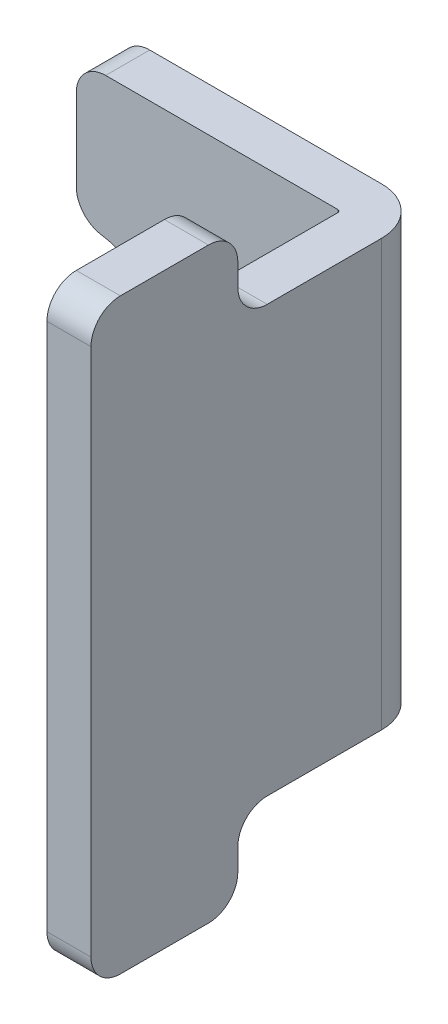
ISO-10303-21;
HEADER;
FILE_DESCRIPTION(('STEP AP214'),'2;1');
FILE_NAME('part.step','',(''),(''),'','','');
FILE_SCHEMA(('AUTOMOTIVE_DESIGN { 1 0 10303 214 1 1 1 1 }'));
ENDSEC;
DATA;
#1=APPLICATION_CONTEXT('core data for automotive mechanical design processes');
#2=APPLICATION_PROTOCOL_DEFINITION('international standard','automotive_design',2000,#1);
#3=PRODUCT_CONTEXT('',#1,'mechanical');
#4=PRODUCT('Part','Part','',(#3));
#5=PRODUCT_RELATED_PRODUCT_CATEGORY('part','',(#4));
#6=PRODUCT_DEFINITION_FORMATION('','',#4);
#7=PRODUCT_DEFINITION_CONTEXT('part definition',#1,'design');
#8=PRODUCT_DEFINITION('design','',#6,#7);
#9=PRODUCT_DEFINITION_SHAPE('','',#8);
#10=(LENGTH_UNIT() NAMED_UNIT(*) SI_UNIT(.MILLI.,.METRE.));
#11=(NAMED_UNIT(*) PLANE_ANGLE_UNIT() SI_UNIT($,.RADIAN.));
#12=(NAMED_UNIT(*) SI_UNIT($,.STERADIAN.) SOLID_ANGLE_UNIT());
#13=UNCERTAINTY_MEASURE_WITH_UNIT(LENGTH_MEASURE(1.E-05),#10,'distance_accuracy_value','');
#14=(GEOMETRIC_REPRESENTATION_CONTEXT(3) GLOBAL_UNCERTAINTY_ASSIGNED_CONTEXT((#13)) GLOBAL_UNIT_ASSIGNED_CONTEXT((#10,
#11,#12)) REPRESENTATION_CONTEXT('',''));
#15=CARTESIAN_POINT('',(0.,0.,0.));
#16=DIRECTION('',(0.,0.,1.));
#17=DIRECTION('',(1.,0.,0.));
#18=AXIS2_PLACEMENT_3D('',#15,#16,#17);
#19=CARTESIAN_POINT('',(-7.25,-3.0075,-2.38475837112732));
#20=DIRECTION('',(0.,0.,1.));
#21=DIRECTION('',(1.,0.,0.));
#22=AXIS2_PLACEMENT_3D('',#19,#20,#21);
#23=CYLINDRICAL_SURFACE('',#22,0.25);
#24=DIRECTION('',(0.,0.,1.));
#25=VECTOR('',#24,1.);
#26=CARTESIAN_POINT('',(-7.21428571428571,-2.7600641703473,-2.38475837112732));
#27=LINE('',#26,#25);
#28=CARTESIAN_POINT('',(-7.21428571428571,-2.7600641703473,0.));
#29=VERTEX_POINT('',#28);
#30=CARTESIAN_POINT('',(-7.21428571428571,-2.7600641703473,0.15));
#31=VERTEX_POINT('',#30);
#32=EDGE_CURVE('E290',#29,#31,#27,.T.);
#33=ORIENTED_EDGE('',*,*,#32,.F.);
#34=CARTESIAN_POINT('',(-7.25,-3.0075,0.));
#35=DIRECTION('',(0.,0.,1.));
#36=DIRECTION('',(1.,0.,0.));
#37=AXIS2_PLACEMENT_3D('',#34,#35,#36);
#38=CIRCLE('',#37,0.25);
#39=CARTESIAN_POINT('',(-7.21428571428571,-3.2549358296527,0.));
#40=VERTEX_POINT('',#39);
#41=EDGE_CURVE('E285',#40,#29,#38,.T.);
#42=ORIENTED_EDGE('',*,*,#41,.F.);
#43=DIRECTION('',(0.,0.,1.));
#44=VECTOR('',#43,1.);
#45=CARTESIAN_POINT('',(-7.21428571428572,-3.2549358296527,-2.38475837112732));
#46=LINE('',#45,#44);
#47=CARTESIAN_POINT('',(-7.21428571428571,-3.2549358296527,0.15));
#48=VERTEX_POINT('',#47);
#49=EDGE_CURVE('E279',#48,#40,#46,.F.);
#50=ORIENTED_EDGE('',*,*,#49,.F.);
#51=CARTESIAN_POINT('',(-7.25,-3.0075,0.15));
#52=DIRECTION('',(0.,0.,1.));
#53=DIRECTION('',(1.,0.,0.));
#54=AXIS2_PLACEMENT_3D('',#51,#52,#53);
#55=CIRCLE('',#54,0.25);
#56=EDGE_CURVE('E336',#48,#31,#55,.T.);
#57=ORIENTED_EDGE('',*,*,#56,.T.);
#58=EDGE_LOOP('',(#33,#42,#50,#57));
#59=FACE_BOUND('',#58,.T.);
#60=ADVANCED_FACE('F17',(#59),#23,.F.);
#61=CARTESIAN_POINT('',(-7.2,-2.66108983848622,-2.38475837112732));
#62=DIRECTION('',(0.,0.,1.));
#63=DIRECTION('',(1.,0.,0.));
#64=AXIS2_PLACEMENT_3D('',#61,#62,#63);
#65=CYLINDRICAL_SURFACE('',#64,0.1);
#66=CARTESIAN_POINT('',(-7.2,-2.66108983848622,0.15));
#67=DIRECTION('',(0.,0.,1.));
#68=DIRECTION('',(1.,0.,0.));
#69=AXIS2_PLACEMENT_3D('',#66,#67,#68);
#70=CIRCLE('',#69,0.1);
#71=CARTESIAN_POINT('',(-7.3,-2.66108983848622,0.15));
#72=VERTEX_POINT('',#71);
#73=EDGE_CURVE('E269',#31,#72,#70,.F.);
#74=ORIENTED_EDGE('',*,*,#73,.T.);
#75=DIRECTION('',(0.,0.,1.));
#76=VECTOR('',#75,1.);
#77=CARTESIAN_POINT('',(-7.3,-2.66108983848622,0.));
#78=LINE('',#77,#76);
#79=CARTESIAN_POINT('',(-7.3,-2.66108983848622,0.));
#80=VERTEX_POINT('',#79);
#81=EDGE_CURVE('E281',#72,#80,#78,.F.);
#82=ORIENTED_EDGE('',*,*,#81,.T.);
#83=CARTESIAN_POINT('',(-7.2,-2.66108983848622,0.));
#84=DIRECTION('',(0.,0.,1.));
#85=DIRECTION('',(1.,0.,0.));
#86=AXIS2_PLACEMENT_3D('',#83,#84,#85);
#87=CIRCLE('',#86,0.1);
#88=EDGE_CURVE('E264',#29,#80,#87,.F.);
#89=ORIENTED_EDGE('',*,*,#88,.F.);
#90=ORIENTED_EDGE('',*,*,#32,.T.);
#91=EDGE_LOOP('',(#74,#82,#89,#90));
#92=FACE_BOUND('',#91,.T.);
#93=ADVANCED_FACE('F619',(#92),#65,.T.);
#94=CARTESIAN_POINT('',(-7.3,-3.7325,0.));
#95=DIRECTION('',(1.,0.,0.));
#96=DIRECTION('',(0.,1.,0.));
#97=AXIS2_PLACEMENT_3D('',#94,#95,#96);
#98=PLANE('',#97);
#99=ORIENTED_EDGE('',*,*,#81,.F.);
#100=DIRECTION('',(0.,1.,0.));
#101=VECTOR('',#100,1.);
#102=CARTESIAN_POINT('',(-7.3,-3.0075,0.15));
#103=LINE('',#102,#101);
#104=CARTESIAN_POINT('',(-7.3,-2.3825,0.15));
#105=VERTEX_POINT('',#104);
#106=EDGE_CURVE('E266',#72,#105,#103,.T.);
#107=ORIENTED_EDGE('',*,*,#106,.T.);
#108=DIRECTION('',(0.,0.,-1.));
#109=VECTOR('',#108,1.);
#110=CARTESIAN_POINT('',(-7.3,-2.3825,0.65));
#111=LINE('',#110,#109);
#112=CARTESIAN_POINT('',(-7.3,-2.3825,0.));
#113=VERTEX_POINT('',#112);
#114=EDGE_CURVE('E286',#113,#105,#111,.F.);
#115=ORIENTED_EDGE('',*,*,#114,.F.);
#116=DIRECTION('',(0.,1.,0.));
#117=VECTOR('',#116,1.);
#118=CARTESIAN_POINT('',(-7.3,-3.0075,0.));
#119=LINE('',#118,#117);
#120=EDGE_CURVE('E262',#80,#113,#119,.T.);
#121=ORIENTED_EDGE('',*,*,#120,.F.);
#122=EDGE_LOOP('',(#99,#107,#115,#121));
#123=FACE_BOUND('',#122,.T.);
#124=ADVANCED_FACE('F609',(#123),#98,.F.);
#125=CARTESIAN_POINT('',(-7.3,-3.7325,0.));
#126=DIRECTION('',(1.,0.,0.));
#127=DIRECTION('',(0.,1.,0.));
#128=AXIS2_PLACEMENT_3D('',#125,#126,#127);
#129=PLANE('',#128);
#130=DIRECTION('',(0.,0.,1.));
#131=VECTOR('',#130,1.);
#132=CARTESIAN_POINT('',(-7.3,-3.35391016151377,-2.38475837112732));
#133=LINE('',#132,#131);
#134=CARTESIAN_POINT('',(-7.3,-3.35391016151378,0.));
#135=VERTEX_POINT('',#134);
#136=CARTESIAN_POINT('',(-7.3,-3.35391016151378,0.15));
#137=VERTEX_POINT('',#136);
#138=EDGE_CURVE('E186',#135,#137,#133,.T.);
#139=ORIENTED_EDGE('',*,*,#138,.F.);
#140=DIRECTION('',(0.,1.,0.));
#141=VECTOR('',#140,1.);
#142=CARTESIAN_POINT('',(-7.3,-3.0075,0.));
#143=LINE('',#142,#141);
#144=CARTESIAN_POINT('',(-7.3,-3.6325,0.));
#145=VERTEX_POINT('',#144);
#146=EDGE_CURVE('E258',#145,#135,#143,.T.);
#147=ORIENTED_EDGE('',*,*,#146,.F.);
#148=DIRECTION('',(0.,0.,-1.));
#149=VECTOR('',#148,1.);
#150=CARTESIAN_POINT('',(-7.3,-3.6325,0.));
#151=LINE('',#150,#149);
#152=CARTESIAN_POINT('',(-7.3,-3.6325,0.15));
#153=VERTEX_POINT('',#152);
#154=EDGE_CURVE('E283',#153,#145,#151,.T.);
#155=ORIENTED_EDGE('',*,*,#154,.F.);
#156=DIRECTION('',(0.,1.,0.));
#157=VECTOR('',#156,1.);
#158=CARTESIAN_POINT('',(-7.3,-3.0075,0.15));
#159=LINE('',#158,#157);
#160=EDGE_CURVE('E193',#153,#137,#159,.T.);
#161=ORIENTED_EDGE('',*,*,#160,.T.);
#162=EDGE_LOOP('',(#139,#147,#155,#161));
#163=FACE_BOUND('',#162,.T.);
#164=ADVANCED_FACE('F599',(#163),#129,.F.);
#165=CARTESIAN_POINT('',(-7.2,-3.35391016151377,-2.38475837112732));
#166=DIRECTION('',(0.,0.,1.));
#167=DIRECTION('',(1.,0.,0.));
#168=AXIS2_PLACEMENT_3D('',#165,#166,#167);
#169=CYLINDRICAL_SURFACE('',#168,0.1);
#170=CARTESIAN_POINT('',(-7.2,-3.35391016151378,0.));
#171=DIRECTION('',(0.,0.,1.));
#172=DIRECTION('',(1.,0.,0.));
#173=AXIS2_PLACEMENT_3D('',#170,#171,#172);
#174=CIRCLE('',#173,0.1);
#175=EDGE_CURVE('E260',#135,#40,#174,.F.);
#176=ORIENTED_EDGE('',*,*,#175,.F.);
#177=ORIENTED_EDGE('',*,*,#138,.T.);
#178=CARTESIAN_POINT('',(-7.2,-3.35391016151378,0.15));
#179=DIRECTION('',(0.,0.,1.));
#180=DIRECTION('',(1.,0.,0.));
#181=AXIS2_PLACEMENT_3D('',#178,#179,#180);
#182=CIRCLE('',#181,0.1);
#183=EDGE_CURVE('E271',#137,#48,#182,.F.);
#184=ORIENTED_EDGE('',*,*,#183,.T.);
#185=ORIENTED_EDGE('',*,*,#49,.T.);
#186=EDGE_LOOP('',(#176,#177,#184,#185));
#187=FACE_BOUND('',#186,.T.);
#188=ADVANCED_FACE('F590',(#187),#169,.T.);
#189=CARTESIAN_POINT('',(-6.41,-3.7325,0.16));
#190=DIRECTION('',(0.,1.,0.));
#191=DIRECTION('',(-1.,0.,0.));
#192=AXIS2_PLACEMENT_3D('',#189,#190,#191);
#193=CYLINDRICAL_SURFACE('',#192,0.01);
#194=DIRECTION('',(0.,1.,0.));
#195=VECTOR('',#194,1.);
#196=CARTESIAN_POINT('',(-6.41,-3.0075,0.15));
#197=LINE('',#196,#195);
#198=CARTESIAN_POINT('',(-6.41,-2.2825,0.15));
#199=VERTEX_POINT('',#198);
#200=CARTESIAN_POINT('',(-6.41,-3.7325,0.15));
#201=VERTEX_POINT('',#200);
#202=EDGE_CURVE('E188',#199,#201,#197,.F.);
#203=ORIENTED_EDGE('',*,*,#202,.T.);
#204=CARTESIAN_POINT('',(-6.41,-3.7325,0.16));
#205=DIRECTION('',(0.,1.,0.));
#206=DIRECTION('',(-1.,0.,0.));
#207=AXIS2_PLACEMENT_3D('',#204,#205,#206);
#208=CIRCLE('',#207,0.01);
#209=CARTESIAN_POINT('',(-6.4,-3.7325,0.16));
#210=VERTEX_POINT('',#209);
#211=EDGE_CURVE('E20',#210,#201,#208,.T.);
#212=ORIENTED_EDGE('',*,*,#211,.F.);
#213=DIRECTION('',(0.,-1.,0.));
#214=VECTOR('',#213,1.);
#215=CARTESIAN_POINT('',(-6.4,-3.0075,0.16));
#216=LINE('',#215,#214);
#217=CARTESIAN_POINT('',(-6.4,-2.2825,0.16));
#218=VERTEX_POINT('',#217);
#219=EDGE_CURVE('E273',#218,#210,#216,.T.);
#220=ORIENTED_EDGE('',*,*,#219,.F.);
#221=CARTESIAN_POINT('',(-6.41,-2.2825,0.16));
#222=DIRECTION('',(0.,1.,0.));
#223=DIRECTION('',(-1.,0.,0.));
#224=AXIS2_PLACEMENT_3D('',#221,#222,#223);
#225=CIRCLE('',#224,0.01);
#226=EDGE_CURVE('E185',#199,#218,#225,.F.);
#227=ORIENTED_EDGE('',*,*,#226,.F.);
#228=EDGE_LOOP('',(#203,#212,#220,#227));
#229=FACE_BOUND('',#228,.T.);
#230=ADVANCED_FACE('F189',(#229),#193,.F.);
#231=CARTESIAN_POINT('',(-7.2,-2.3825,0.65));
#232=DIRECTION('',(0.,0.,-1.));
#233=DIRECTION('',(0.,1.,0.));
#234=AXIS2_PLACEMENT_3D('',#231,#232,#233);
#235=CYLINDRICAL_SURFACE('',#234,0.1);
#236=CARTESIAN_POINT('',(-7.2,-2.3825,0.15));
#237=DIRECTION('',(0.,0.,-1.));
#238=DIRECTION('',(0.,1.,0.));
#239=AXIS2_PLACEMENT_3D('',#236,#237,#238);
#240=CIRCLE('',#239,0.1);
#241=CARTESIAN_POINT('',(-7.2,-2.2825,0.15));
#242=VERTEX_POINT('',#241);
#243=EDGE_CURVE('E194',#105,#242,#240,.T.);
#244=ORIENTED_EDGE('',*,*,#243,.T.);
#245=DIRECTION('',(0.,0.,1.));
#246=VECTOR('',#245,1.);
#247=CARTESIAN_POINT('',(-7.2,-2.2825,0.65));
#248=LINE('',#247,#246);
#249=CARTESIAN_POINT('',(-7.2,-2.2825,0.));
#250=VERTEX_POINT('',#249);
#251=EDGE_CURVE('E218',#250,#242,#248,.T.);
#252=ORIENTED_EDGE('',*,*,#251,.F.);
#253=CARTESIAN_POINT('',(-7.2,-2.3825,0.));
#254=DIRECTION('',(0.,0.,-1.));
#255=DIRECTION('',(0.,1.,0.));
#256=AXIS2_PLACEMENT_3D('',#253,#254,#255);
#257=CIRCLE('',#256,0.1);
#258=EDGE_CURVE('E263',#113,#250,#257,.T.);
#259=ORIENTED_EDGE('',*,*,#258,.F.);
#260=ORIENTED_EDGE('',*,*,#114,.T.);
#261=EDGE_LOOP('',(#244,#252,#259,#260));
#262=FACE_BOUND('',#261,.T.);
#263=ADVANCED_FACE('F572',(#262),#235,.T.);
#264=CARTESIAN_POINT('',(-6.25,-3.0075,0.15));
#265=DIRECTION('',(0.,0.,-1.));
#266=DIRECTION('',(-1.,0.,0.));
#267=AXIS2_PLACEMENT_3D('',#264,#265,#266);
#268=PLANE('',#267);
#269=ORIENTED_EDGE('',*,*,#73,.F.);
#270=ORIENTED_EDGE('',*,*,#56,.F.);
#271=ORIENTED_EDGE('',*,*,#183,.F.);
#272=ORIENTED_EDGE('',*,*,#160,.F.);
#273=CARTESIAN_POINT('',(-7.2,-3.6325,0.15));
#274=DIRECTION('',(0.,0.,-1.));
#275=DIRECTION('',(0.,1.,0.));
#276=AXIS2_PLACEMENT_3D('',#273,#274,#275);
#277=CIRCLE('',#276,0.1);
#278=CARTESIAN_POINT('',(-7.2,-3.7325,0.15));
#279=VERTEX_POINT('',#278);
#280=EDGE_CURVE('E199',#279,#153,#277,.T.);
#281=ORIENTED_EDGE('',*,*,#280,.F.);
#282=DIRECTION('',(1.,0.,0.));
#283=VECTOR('',#282,1.);
#284=CARTESIAN_POINT('',(-6.25,-3.7325,0.15));
#285=LINE('',#284,#283);
#286=EDGE_CURVE('E181',#201,#279,#285,.F.);
#287=ORIENTED_EDGE('',*,*,#286,.F.);
#288=ORIENTED_EDGE('',*,*,#202,.F.);
#289=DIRECTION('',(1.,0.,0.));
#290=VECTOR('',#289,1.);
#291=CARTESIAN_POINT('',(-6.25,-2.2825,0.15));
#292=LINE('',#291,#290);
#293=EDGE_CURVE('E215',#242,#199,#292,.T.);
#294=ORIENTED_EDGE('',*,*,#293,.F.);
#295=ORIENTED_EDGE('',*,*,#243,.F.);
#296=ORIENTED_EDGE('',*,*,#106,.F.);
#297=EDGE_LOOP('',(#269,#270,#271,#272,#281,#287,#288,#294,#295,#296));
#298=FACE_BOUND('',#297,.T.);
#299=ADVANCED_FACE('F197',(#298),#268,.F.);
#300=CARTESIAN_POINT('',(-7.2,-3.6325,0.));
#301=DIRECTION('',(0.,0.,-1.));
#302=DIRECTION('',(0.,1.,0.));
#303=AXIS2_PLACEMENT_3D('',#300,#301,#302);
#304=CYLINDRICAL_SURFACE('',#303,0.1);
#305=ORIENTED_EDGE('',*,*,#280,.T.);
#306=ORIENTED_EDGE('',*,*,#154,.T.);
#307=CARTESIAN_POINT('',(-7.2,-3.6325,0.));
#308=DIRECTION('',(0.,0.,-1.));
#309=DIRECTION('',(0.,1.,0.));
#310=AXIS2_PLACEMENT_3D('',#307,#308,#309);
#311=CIRCLE('',#310,0.1);
#312=CARTESIAN_POINT('',(-7.2,-3.7325,0.));
#313=VERTEX_POINT('',#312);
#314=EDGE_CURVE('E261',#313,#145,#311,.T.);
#315=ORIENTED_EDGE('',*,*,#314,.F.);
#316=DIRECTION('',(0.,0.,-1.));
#317=VECTOR('',#316,1.);
#318=CARTESIAN_POINT('',(-7.2,-3.7325,0.15));
#319=LINE('',#318,#317);
#320=EDGE_CURVE('E201',#279,#313,#319,.T.);
#321=ORIENTED_EDGE('',*,*,#320,.F.);
#322=EDGE_LOOP('',(#305,#306,#315,#321));
#323=FACE_BOUND('',#322,.T.);
#324=ADVANCED_FACE('F553',(#323),#304,.T.);
#325=CARTESIAN_POINT('',(-6.25,-3.0075,0.));
#326=DIRECTION('',(0.,0.,-1.));
#327=DIRECTION('',(-1.,0.,0.));
#328=AXIS2_PLACEMENT_3D('',#325,#326,#327);
#329=PLANE('',#328);
#330=ORIENTED_EDGE('',*,*,#146,.T.);
#331=ORIENTED_EDGE('',*,*,#175,.T.);
#332=ORIENTED_EDGE('',*,*,#41,.T.);
#333=ORIENTED_EDGE('',*,*,#88,.T.);
#334=ORIENTED_EDGE('',*,*,#120,.T.);
#335=ORIENTED_EDGE('',*,*,#258,.T.);
#336=DIRECTION('',(1.,0.,0.));
#337=VECTOR('',#336,1.);
#338=CARTESIAN_POINT('',(-6.25,-2.2825,0.));
#339=LINE('',#338,#337);
#340=CARTESIAN_POINT('',(-6.41,-2.2825,0.));
#341=VERTEX_POINT('',#340);
#342=EDGE_CURVE('E219',#341,#250,#339,.F.);
#343=ORIENTED_EDGE('',*,*,#342,.F.);
#344=DIRECTION('',(0.,1.,0.));
#345=VECTOR('',#344,1.);
#346=CARTESIAN_POINT('',(-6.41,-3.7325,0.));
#347=LINE('',#346,#345);
#348=CARTESIAN_POINT('',(-6.41,-3.7325,0.));
#349=VERTEX_POINT('',#348);
#350=EDGE_CURVE('E205',#349,#341,#347,.T.);
#351=ORIENTED_EDGE('',*,*,#350,.F.);
#352=DIRECTION('',(1.,0.,0.));
#353=VECTOR('',#352,1.);
#354=CARTESIAN_POINT('',(-6.25,-3.7325,0.));
#355=LINE('',#354,#353);
#356=EDGE_CURVE('E203',#313,#349,#355,.T.);
#357=ORIENTED_EDGE('',*,*,#356,.F.);
#358=ORIENTED_EDGE('',*,*,#314,.T.);
#359=EDGE_LOOP('',(#330,#331,#332,#333,#334,#335,#343,#351,#357,#358));
#360=FACE_BOUND('',#359,.T.);
#361=ADVANCED_FACE('F544',(#360),#329,.T.);
#362=CARTESIAN_POINT('',(-6.4,-3.0075,0.9));
#363=DIRECTION('',(-1.,0.,0.));
#364=DIRECTION('',(0.,-1.,0.));
#365=AXIS2_PLACEMENT_3D('',#362,#363,#364);
#366=PLANE('',#365);
#367=DIRECTION('',(0.,-1.,0.));
#368=VECTOR('',#367,1.);
#369=CARTESIAN_POINT('',(-6.4,-2.0075,0.65));
#370=LINE('',#369,#368);
#371=CARTESIAN_POINT('',(-6.4,-3.8325,0.65));
#372=VERTEX_POINT('',#371);
#373=CARTESIAN_POINT('',(-6.4,-3.9075,0.65));
#374=VERTEX_POINT('',#373);
#375=EDGE_CURVE('E251',#372,#374,#370,.T.);
#376=ORIENTED_EDGE('',*,*,#375,.T.);
#377=CARTESIAN_POINT('',(-6.4,-3.9075,0.75));
#378=DIRECTION('',(1.,0.,0.));
#379=DIRECTION('',(0.,1.,0.));
#380=AXIS2_PLACEMENT_3D('',#377,#378,#379);
#381=CIRCLE('',#380,0.1);
#382=CARTESIAN_POINT('',(-6.4,-4.0075,0.75));
#383=VERTEX_POINT('',#382);
#384=EDGE_CURVE('E254',#383,#374,#381,.T.);
#385=ORIENTED_EDGE('',*,*,#384,.F.);
#386=DIRECTION('',(0.,0.,1.));
#387=VECTOR('',#386,1.);
#388=CARTESIAN_POINT('',(-6.4,-4.0075,0.65));
#389=LINE('',#388,#387);
#390=CARTESIAN_POINT('',(-6.4,-4.0075,1.05));
#391=VERTEX_POINT('',#390);
#392=EDGE_CURVE('E246',#383,#391,#389,.T.);
#393=ORIENTED_EDGE('',*,*,#392,.T.);
#394=CARTESIAN_POINT('',(-6.4,-3.9075,1.05));
#395=DIRECTION('',(1.,0.,0.));
#396=DIRECTION('',(0.,1.,0.));
#397=AXIS2_PLACEMENT_3D('',#394,#395,#396);
#398=CIRCLE('',#397,0.1);
#399=CARTESIAN_POINT('',(-6.4,-3.9075,1.15));
#400=VERTEX_POINT('',#399);
#401=EDGE_CURVE('E249',#400,#391,#398,.T.);
#402=ORIENTED_EDGE('',*,*,#401,.F.);
#403=DIRECTION('',(0.,1.,0.));
#404=VECTOR('',#403,1.);
#405=CARTESIAN_POINT('',(-6.4,-4.0075,1.15));
#406=LINE('',#405,#404);
#407=CARTESIAN_POINT('',(-6.4,-2.1075,1.15));
#408=VERTEX_POINT('',#407);
#409=EDGE_CURVE('E242',#400,#408,#406,.T.);
#410=ORIENTED_EDGE('',*,*,#409,.T.);
#411=CARTESIAN_POINT('',(-6.4,-2.1075,1.05));
#412=DIRECTION('',(1.,0.,0.));
#413=DIRECTION('',(0.,1.,0.));
#414=AXIS2_PLACEMENT_3D('',#411,#412,#413);
#415=CIRCLE('',#414,0.1);
#416=CARTESIAN_POINT('',(-6.4,-2.0075,1.05));
#417=VERTEX_POINT('',#416);
#418=EDGE_CURVE('E241',#417,#408,#415,.T.);
#419=ORIENTED_EDGE('',*,*,#418,.F.);
#420=DIRECTION('',(0.,0.,1.));
#421=VECTOR('',#420,1.);
#422=CARTESIAN_POINT('',(-6.4,-2.0075,1.15));
#423=LINE('',#422,#421);
#424=CARTESIAN_POINT('',(-6.4,-2.0075,0.75));
#425=VERTEX_POINT('',#424);
#426=EDGE_CURVE('E240',#417,#425,#423,.F.);
#427=ORIENTED_EDGE('',*,*,#426,.T.);
#428=CARTESIAN_POINT('',(-6.4,-2.1075,0.75));
#429=DIRECTION('',(1.,0.,0.));
#430=DIRECTION('',(0.,1.,0.));
#431=AXIS2_PLACEMENT_3D('',#428,#429,#430);
#432=CIRCLE('',#431,0.1);
#433=CARTESIAN_POINT('',(-6.4,-2.1075,0.65));
#434=VERTEX_POINT('',#433);
#435=EDGE_CURVE('E236',#434,#425,#432,.T.);
#436=ORIENTED_EDGE('',*,*,#435,.F.);
#437=DIRECTION('',(0.,-1.,0.));
#438=VECTOR('',#437,1.);
#439=CARTESIAN_POINT('',(-6.4,-2.0075,0.65));
#440=LINE('',#439,#438);
#441=CARTESIAN_POINT('',(-6.4,-2.1825,0.65));
#442=VERTEX_POINT('',#441);
#443=EDGE_CURVE('E230',#434,#442,#440,.T.);
#444=ORIENTED_EDGE('',*,*,#443,.T.);
#445=CARTESIAN_POINT('',(-6.4,-2.1825,0.55));
#446=DIRECTION('',(-1.,0.,0.));
#447=DIRECTION('',(0.,-1.,0.));
#448=AXIS2_PLACEMENT_3D('',#445,#446,#447);
#449=CIRCLE('',#448,0.1);
#450=CARTESIAN_POINT('',(-6.4,-2.2825,0.55));
#451=VERTEX_POINT('',#450);
#452=EDGE_CURVE('E225',#442,#451,#449,.F.);
#453=ORIENTED_EDGE('',*,*,#452,.T.);
#454=DIRECTION('',(0.,0.,1.));
#455=VECTOR('',#454,1.);
#456=CARTESIAN_POINT('',(-6.4,-2.2825,0.65));
#457=LINE('',#456,#455);
#458=EDGE_CURVE('E223',#218,#451,#457,.T.);
#459=ORIENTED_EDGE('',*,*,#458,.F.);
#460=ORIENTED_EDGE('',*,*,#219,.T.);
#461=DIRECTION('',(0.,0.,-1.));
#462=VECTOR('',#461,1.);
#463=CARTESIAN_POINT('',(-6.4,-3.7325,0.15));
#464=LINE('',#463,#462);
#465=CARTESIAN_POINT('',(-6.4,-3.7325,0.55));
#466=VERTEX_POINT('',#465);
#467=EDGE_CURVE('E184',#466,#210,#464,.T.);
#468=ORIENTED_EDGE('',*,*,#467,.F.);
#469=CARTESIAN_POINT('',(-6.4,-3.8325,0.55));
#470=DIRECTION('',(-1.,0.,0.));
#471=DIRECTION('',(0.,-1.,0.));
#472=AXIS2_PLACEMENT_3D('',#469,#470,#471);
#473=CIRCLE('',#472,0.1);
#474=EDGE_CURVE('E316',#466,#372,#473,.F.);
#475=ORIENTED_EDGE('',*,*,#474,.T.);
#476=EDGE_LOOP('',(#376,#385,#393,#402,#410,#419,#427,#436,#444,#453,#459,#460,#468,#475));
#477=FACE_BOUND('',#476,.T.);
#478=ADVANCED_FACE('F346',(#477),#366,.T.);
#479=CARTESIAN_POINT('',(-6.4,-2.1075,1.05));
#480=DIRECTION('',(1.,0.,0.));
#481=DIRECTION('',(0.,1.,0.));
#482=AXIS2_PLACEMENT_3D('',#479,#480,#481);
#483=CYLINDRICAL_SURFACE('',#482,0.1);
#484=CARTESIAN_POINT('',(-6.25,-2.1075,1.05));
#485=DIRECTION('',(1.,0.,0.));
#486=DIRECTION('',(0.,1.,0.));
#487=AXIS2_PLACEMENT_3D('',#484,#485,#486);
#488=CIRCLE('',#487,0.1);
#489=CARTESIAN_POINT('',(-6.25,-2.1075,1.15));
#490=VERTEX_POINT('',#489);
#491=CARTESIAN_POINT('',(-6.25,-2.0075,1.05));
#492=VERTEX_POINT('',#491);
#493=EDGE_CURVE('E245',#490,#492,#488,.F.);
#494=ORIENTED_EDGE('',*,*,#493,.T.);
#495=DIRECTION('',(1.,0.,0.));
#496=VECTOR('',#495,1.);
#497=CARTESIAN_POINT('',(-6.4,-2.0075,1.05));
#498=LINE('',#497,#496);
#499=EDGE_CURVE('E237',#492,#417,#498,.F.);
#500=ORIENTED_EDGE('',*,*,#499,.T.);
#501=ORIENTED_EDGE('',*,*,#418,.T.);
#502=DIRECTION('',(1.,0.,0.));
#503=VECTOR('',#502,1.);
#504=CARTESIAN_POINT('',(-6.4,-2.1075,1.15));
#505=LINE('',#504,#503);
#506=EDGE_CURVE('E371',#408,#490,#505,.T.);
#507=ORIENTED_EDGE('',*,*,#506,.T.);
#508=EDGE_LOOP('',(#494,#500,#501,#507));
#509=FACE_BOUND('',#508,.T.);
#510=ADVANCED_FACE('F525',(#509),#483,.T.);
#511=CARTESIAN_POINT('',(-6.4,-2.0075,1.15));
#512=DIRECTION('',(0.,-1.,0.));
#513=DIRECTION('',(1.,0.,0.));
#514=AXIS2_PLACEMENT_3D('',#511,#512,#513);
#515=PLANE('',#514);
#516=ORIENTED_EDGE('',*,*,#499,.F.);
#517=DIRECTION('',(0.,0.,1.));
#518=VECTOR('',#517,1.);
#519=CARTESIAN_POINT('',(-6.25,-2.0075,0.9));
#520=LINE('',#519,#518);
#521=CARTESIAN_POINT('',(-6.25,-2.0075,0.75));
#522=VERTEX_POINT('',#521);
#523=EDGE_CURVE('E309',#492,#522,#520,.F.);
#524=ORIENTED_EDGE('',*,*,#523,.T.);
#525=DIRECTION('',(1.,0.,0.));
#526=VECTOR('',#525,1.);
#527=CARTESIAN_POINT('',(-6.4,-2.0075,0.75));
#528=LINE('',#527,#526);
#529=EDGE_CURVE('E234',#425,#522,#528,.T.);
#530=ORIENTED_EDGE('',*,*,#529,.F.);
#531=ORIENTED_EDGE('',*,*,#426,.F.);
#532=EDGE_LOOP('',(#516,#524,#530,#531));
#533=FACE_BOUND('',#532,.T.);
#534=ADVANCED_FACE('F515',(#533),#515,.F.);
#535=CARTESIAN_POINT('',(-6.4,-2.1075,0.75));
#536=DIRECTION('',(1.,0.,0.));
#537=DIRECTION('',(0.,1.,0.));
#538=AXIS2_PLACEMENT_3D('',#535,#536,#537);
#539=CYLINDRICAL_SURFACE('',#538,0.1);
#540=CARTESIAN_POINT('',(-6.25,-2.1075,0.75));
#541=DIRECTION('',(1.,0.,0.));
#542=DIRECTION('',(0.,1.,0.));
#543=AXIS2_PLACEMENT_3D('',#540,#541,#542);
#544=CIRCLE('',#543,0.1);
#545=CARTESIAN_POINT('',(-6.25,-2.1075,0.65));
#546=VERTEX_POINT('',#545);
#547=EDGE_CURVE('E306',#522,#546,#544,.F.);
#548=ORIENTED_EDGE('',*,*,#547,.T.);
#549=DIRECTION('',(1.,0.,0.));
#550=VECTOR('',#549,1.);
#551=CARTESIAN_POINT('',(-6.4,-2.1075,0.65));
#552=LINE('',#551,#550);
#553=EDGE_CURVE('E231',#546,#434,#552,.F.);
#554=ORIENTED_EDGE('',*,*,#553,.T.);
#555=ORIENTED_EDGE('',*,*,#435,.T.);
#556=ORIENTED_EDGE('',*,*,#529,.T.);
#557=EDGE_LOOP('',(#548,#554,#555,#556));
#558=FACE_BOUND('',#557,.T.);
#559=ADVANCED_FACE('F505',(#558),#539,.T.);
#560=CARTESIAN_POINT('',(-6.4,-2.0075,0.65));
#561=DIRECTION('',(0.,0.,1.));
#562=DIRECTION('',(0.,-1.,0.));
#563=AXIS2_PLACEMENT_3D('',#560,#561,#562);
#564=PLANE('',#563);
#565=ORIENTED_EDGE('',*,*,#553,.F.);
#566=DIRECTION('',(0.,-1.,0.));
#567=VECTOR('',#566,1.);
#568=CARTESIAN_POINT('',(-6.25,-3.0075,0.65));
#569=LINE('',#568,#567);
#570=CARTESIAN_POINT('',(-6.25,-2.1825,0.65));
#571=VERTEX_POINT('',#570);
#572=EDGE_CURVE('E305',#546,#571,#569,.T.);
#573=ORIENTED_EDGE('',*,*,#572,.T.);
#574=DIRECTION('',(-1.,0.,0.));
#575=VECTOR('',#574,1.);
#576=CARTESIAN_POINT('',(-6.4,-2.1825,0.65));
#577=LINE('',#576,#575);
#578=EDGE_CURVE('E227',#571,#442,#577,.T.);
#579=ORIENTED_EDGE('',*,*,#578,.T.);
#580=ORIENTED_EDGE('',*,*,#443,.F.);
#581=EDGE_LOOP('',(#565,#573,#579,#580));
#582=FACE_BOUND('',#581,.T.);
#583=ADVANCED_FACE('F496',(#582),#564,.F.);
#584=CARTESIAN_POINT('',(-6.4,-2.1825,0.55));
#585=DIRECTION('',(-1.,0.,0.));
#586=DIRECTION('',(0.,-1.,0.));
#587=AXIS2_PLACEMENT_3D('',#584,#585,#586);
#588=CYLINDRICAL_SURFACE('',#587,0.1);
#589=DIRECTION('',(1.,0.,0.));
#590=VECTOR('',#589,1.);
#591=CARTESIAN_POINT('',(-6.25,-2.2825,0.55));
#592=LINE('',#591,#590);
#593=CARTESIAN_POINT('',(-6.25,-2.2825,0.55));
#594=VERTEX_POINT('',#593);
#595=EDGE_CURVE('E222',#451,#594,#592,.T.);
#596=ORIENTED_EDGE('',*,*,#595,.F.);
#597=ORIENTED_EDGE('',*,*,#452,.F.);
#598=ORIENTED_EDGE('',*,*,#578,.F.);
#599=CARTESIAN_POINT('',(-6.25,-2.1825,0.55));
#600=DIRECTION('',(-1.,0.,0.));
#601=DIRECTION('',(0.,-1.,0.));
#602=AXIS2_PLACEMENT_3D('',#599,#600,#601);
#603=CIRCLE('',#602,0.1);
#604=EDGE_CURVE('E302',#571,#594,#603,.F.);
#605=ORIENTED_EDGE('',*,*,#604,.T.);
#606=EDGE_LOOP('',(#596,#597,#598,#605));
#607=FACE_BOUND('',#606,.T.);
#608=ADVANCED_FACE('F351',(#607),#588,.F.);
#609=CARTESIAN_POINT('',(-6.25,-2.2825,0.65));
#610=DIRECTION('',(0.,1.,0.));
#611=DIRECTION('',(0.,0.,1.));
#612=AXIS2_PLACEMENT_3D('',#609,#610,#611);
#613=PLANE('',#612);
#614=ORIENTED_EDGE('',*,*,#293,.T.);
#615=ORIENTED_EDGE('',*,*,#226,.T.);
#616=ORIENTED_EDGE('',*,*,#458,.T.);
#617=ORIENTED_EDGE('',*,*,#595,.T.);
#618=DIRECTION('',(0.,0.,1.));
#619=VECTOR('',#618,1.);
#620=CARTESIAN_POINT('',(-6.25,-2.2825,0.9));
#621=LINE('',#620,#619);
#622=CARTESIAN_POINT('',(-6.25,-2.2825,0.16));
#623=VERTEX_POINT('',#622);
#624=EDGE_CURVE('E214',#594,#623,#621,.F.);
#625=ORIENTED_EDGE('',*,*,#624,.T.);
#626=CARTESIAN_POINT('',(-6.41,-2.2825,0.16));
#627=DIRECTION('',(0.,1.,0.));
#628=DIRECTION('',(-1.,0.,0.));
#629=AXIS2_PLACEMENT_3D('',#626,#627,#628);
#630=CIRCLE('',#629,0.16);
#631=EDGE_CURVE('E217',#341,#623,#630,.F.);
#632=ORIENTED_EDGE('',*,*,#631,.F.);
#633=ORIENTED_EDGE('',*,*,#342,.T.);
#634=ORIENTED_EDGE('',*,*,#251,.T.);
#635=EDGE_LOOP('',(#614,#615,#616,#617,#625,#632,#633,#634));
#636=FACE_BOUND('',#635,.T.);
#637=ADVANCED_FACE('F343',(#636),#613,.T.);
#638=CARTESIAN_POINT('',(-6.41,-3.7325,0.16));
#639=DIRECTION('',(0.,1.,0.));
#640=DIRECTION('',(-1.,0.,0.));
#641=AXIS2_PLACEMENT_3D('',#638,#639,#640);
#642=CYLINDRICAL_SURFACE('',#641,0.16);
#643=CARTESIAN_POINT('',(-6.41,-3.7325,0.16));
#644=DIRECTION('',(0.,1.,0.));
#645=DIRECTION('',(-1.,0.,0.));
#646=AXIS2_PLACEMENT_3D('',#643,#644,#645);
#647=CIRCLE('',#646,0.16);
#648=CARTESIAN_POINT('',(-6.25,-3.7325,0.16));
#649=VERTEX_POINT('',#648);
#650=EDGE_CURVE('E319',#349,#649,#647,.F.);
#651=ORIENTED_EDGE('',*,*,#650,.F.);
#652=ORIENTED_EDGE('',*,*,#350,.T.);
#653=ORIENTED_EDGE('',*,*,#631,.T.);
#654=DIRECTION('',(0.,-1.,0.));
#655=VECTOR('',#654,1.);
#656=CARTESIAN_POINT('',(-6.25,-3.0075,0.16));
#657=LINE('',#656,#655);
#658=EDGE_CURVE('E210',#623,#649,#657,.T.);
#659=ORIENTED_EDGE('',*,*,#658,.T.);
#660=EDGE_LOOP('',(#651,#652,#653,#659));
#661=FACE_BOUND('',#660,.T.);
#662=ADVANCED_FACE('F470',(#661),#642,.T.);
#663=CARTESIAN_POINT('',(-6.25,-3.7325,0.15));
#664=DIRECTION('',(0.,-1.,0.));
#665=DIRECTION('',(0.,0.,-1.));
#666=AXIS2_PLACEMENT_3D('',#663,#664,#665);
#667=PLANE('',#666);
#668=ORIENTED_EDGE('',*,*,#356,.T.);
#669=ORIENTED_EDGE('',*,*,#650,.T.);
#670=DIRECTION('',(0.,0.,1.));
#671=VECTOR('',#670,1.);
#672=CARTESIAN_POINT('',(-6.25,-3.7325,0.9));
#673=LINE('',#672,#671);
#674=CARTESIAN_POINT('',(-6.25,-3.7325,0.55));
#675=VERTEX_POINT('',#674);
#676=EDGE_CURVE('E213',#649,#675,#673,.T.);
#677=ORIENTED_EDGE('',*,*,#676,.T.);
#678=DIRECTION('',(-1.,0.,0.));
#679=VECTOR('',#678,1.);
#680=CARTESIAN_POINT('',(-6.25,-3.7325,0.55));
#681=LINE('',#680,#679);
#682=EDGE_CURVE('E318',#675,#466,#681,.T.);
#683=ORIENTED_EDGE('',*,*,#682,.T.);
#684=ORIENTED_EDGE('',*,*,#467,.T.);
#685=ORIENTED_EDGE('',*,*,#211,.T.);
#686=ORIENTED_EDGE('',*,*,#286,.T.);
#687=ORIENTED_EDGE('',*,*,#320,.T.);
#688=EDGE_LOOP('',(#668,#669,#677,#683,#684,#685,#686,#687));
#689=FACE_BOUND('',#688,.T.);
#690=ADVANCED_FACE('F179',(#689),#667,.T.);
#691=CARTESIAN_POINT('',(-6.25,-3.8325,0.55));
#692=DIRECTION('',(-1.,0.,0.));
#693=DIRECTION('',(0.,-1.,0.));
#694=AXIS2_PLACEMENT_3D('',#691,#692,#693);
#695=CYLINDRICAL_SURFACE('',#694,0.1);
#696=DIRECTION('',(1.,0.,0.));
#697=VECTOR('',#696,1.);
#698=CARTESIAN_POINT('',(-6.4,-3.8325,0.65));
#699=LINE('',#698,#697);
#700=CARTESIAN_POINT('',(-6.25,-3.8325,0.65));
#701=VERTEX_POINT('',#700);
#702=EDGE_CURVE('E255',#701,#372,#699,.F.);
#703=ORIENTED_EDGE('',*,*,#702,.T.);
#704=ORIENTED_EDGE('',*,*,#474,.F.);
#705=ORIENTED_EDGE('',*,*,#682,.F.);
#706=CARTESIAN_POINT('',(-6.25,-3.8325,0.55));
#707=DIRECTION('',(-1.,0.,0.));
#708=DIRECTION('',(0.,-1.,0.));
#709=AXIS2_PLACEMENT_3D('',#706,#707,#708);
#710=CIRCLE('',#709,0.1);
#711=EDGE_CURVE('E299',#675,#701,#710,.F.);
#712=ORIENTED_EDGE('',*,*,#711,.T.);
#713=EDGE_LOOP('',(#703,#704,#705,#712));
#714=FACE_BOUND('',#713,.T.);
#715=ADVANCED_FACE('F383',(#714),#695,.F.);
#716=CARTESIAN_POINT('',(-6.4,-2.0075,0.65));
#717=DIRECTION('',(0.,0.,1.));
#718=DIRECTION('',(0.,-1.,0.));
#719=AXIS2_PLACEMENT_3D('',#716,#717,#718);
#720=PLANE('',#719);
#721=DIRECTION('',(1.,0.,0.));
#722=VECTOR('',#721,1.);
#723=CARTESIAN_POINT('',(-6.4,-3.9075,0.65));
#724=LINE('',#723,#722);
#725=CARTESIAN_POINT('',(-6.25,-3.9075,0.65));
#726=VERTEX_POINT('',#725);
#727=EDGE_CURVE('E315',#374,#726,#724,.T.);
#728=ORIENTED_EDGE('',*,*,#727,.F.);
#729=ORIENTED_EDGE('',*,*,#375,.F.);
#730=ORIENTED_EDGE('',*,*,#702,.F.);
#731=DIRECTION('',(0.,-1.,0.));
#732=VECTOR('',#731,1.);
#733=CARTESIAN_POINT('',(-6.25,-3.0075,0.65));
#734=LINE('',#733,#732);
#735=EDGE_CURVE('E298',#701,#726,#734,.T.);
#736=ORIENTED_EDGE('',*,*,#735,.T.);
#737=EDGE_LOOP('',(#728,#729,#730,#736));
#738=FACE_BOUND('',#737,.T.);
#739=ADVANCED_FACE('F399',(#738),#720,.F.);
#740=CARTESIAN_POINT('',(-6.4,-3.9075,0.75));
#741=DIRECTION('',(1.,0.,0.));
#742=DIRECTION('',(0.,1.,0.));
#743=AXIS2_PLACEMENT_3D('',#740,#741,#742);
#744=CYLINDRICAL_SURFACE('',#743,0.1);
#745=CARTESIAN_POINT('',(-6.25,-3.9075,0.75));
#746=DIRECTION('',(1.,0.,0.));
#747=DIRECTION('',(0.,1.,0.));
#748=AXIS2_PLACEMENT_3D('',#745,#746,#747);
#749=CIRCLE('',#748,0.1);
#750=CARTESIAN_POINT('',(-6.25,-4.0075,0.75));
#751=VERTEX_POINT('',#750);
#752=EDGE_CURVE('E295',#726,#751,#749,.F.);
#753=ORIENTED_EDGE('',*,*,#752,.T.);
#754=DIRECTION('',(1.,0.,0.));
#755=VECTOR('',#754,1.);
#756=CARTESIAN_POINT('',(-6.4,-4.0075,0.75));
#757=LINE('',#756,#755);
#758=EDGE_CURVE('E250',#751,#383,#757,.F.);
#759=ORIENTED_EDGE('',*,*,#758,.T.);
#760=ORIENTED_EDGE('',*,*,#384,.T.);
#761=ORIENTED_EDGE('',*,*,#727,.T.);
#762=EDGE_LOOP('',(#753,#759,#760,#761));
#763=FACE_BOUND('',#762,.T.);
#764=ADVANCED_FACE('F397',(#763),#744,.T.);
#765=CARTESIAN_POINT('',(-6.4,-4.0075,0.65));
#766=DIRECTION('',(0.,1.,0.));
#767=DIRECTION('',(0.,0.,1.));
#768=AXIS2_PLACEMENT_3D('',#765,#766,#767);
#769=PLANE('',#768);
#770=DIRECTION('',(1.,0.,0.));
#771=VECTOR('',#770,1.);
#772=CARTESIAN_POINT('',(-6.4,-4.0075,1.05));
#773=LINE('',#772,#771);
#774=CARTESIAN_POINT('',(-6.25,-4.0075,1.05));
#775=VERTEX_POINT('',#774);
#776=EDGE_CURVE('E313',#391,#775,#773,.T.);
#777=ORIENTED_EDGE('',*,*,#776,.F.);
#778=ORIENTED_EDGE('',*,*,#392,.F.);
#779=ORIENTED_EDGE('',*,*,#758,.F.);
#780=DIRECTION('',(0.,0.,1.));
#781=VECTOR('',#780,1.);
#782=CARTESIAN_POINT('',(-6.25,-4.0075,0.9));
#783=LINE('',#782,#781);
#784=EDGE_CURVE('E294',#751,#775,#783,.T.);
#785=ORIENTED_EDGE('',*,*,#784,.T.);
#786=EDGE_LOOP('',(#777,#778,#779,#785));
#787=FACE_BOUND('',#786,.T.);
#788=ADVANCED_FACE('F394',(#787),#769,.F.);
#789=CARTESIAN_POINT('',(-6.4,-3.9075,1.05));
#790=DIRECTION('',(1.,0.,0.));
#791=DIRECTION('',(0.,1.,0.));
#792=AXIS2_PLACEMENT_3D('',#789,#790,#791);
#793=CYLINDRICAL_SURFACE('',#792,0.1);
#794=CARTESIAN_POINT('',(-6.25,-3.9075,1.05));
#795=DIRECTION('',(1.,0.,0.));
#796=DIRECTION('',(0.,1.,0.));
#797=AXIS2_PLACEMENT_3D('',#794,#795,#796);
#798=CIRCLE('',#797,0.1);
#799=CARTESIAN_POINT('',(-6.25,-3.9075,1.15));
#800=VERTEX_POINT('',#799);
#801=EDGE_CURVE('E26',#775,#800,#798,.F.);
#802=ORIENTED_EDGE('',*,*,#801,.T.);
#803=DIRECTION('',(1.,0.,0.));
#804=VECTOR('',#803,1.);
#805=CARTESIAN_POINT('',(-6.4,-3.9075,1.15));
#806=LINE('',#805,#804);
#807=EDGE_CURVE('E34',#800,#400,#806,.F.);
#808=ORIENTED_EDGE('',*,*,#807,.T.);
#809=ORIENTED_EDGE('',*,*,#401,.T.);
#810=ORIENTED_EDGE('',*,*,#776,.T.);
#811=EDGE_LOOP('',(#802,#808,#809,#810));
#812=FACE_BOUND('',#811,.T.);
#813=ADVANCED_FACE('F403',(#812),#793,.T.);
#814=CARTESIAN_POINT('',(-6.4,-4.0075,1.15));
#815=DIRECTION('',(0.,0.,-1.));
#816=DIRECTION('',(0.,1.,0.));
#817=AXIS2_PLACEMENT_3D('',#814,#815,#816);
#818=PLANE('',#817);
#819=ORIENTED_EDGE('',*,*,#807,.F.);
#820=DIRECTION('',(0.,-1.,0.));
#821=VECTOR('',#820,1.);
#822=CARTESIAN_POINT('',(-6.25,-3.0075,1.15));
#823=LINE('',#822,#821);
#824=EDGE_CURVE('E11',#800,#490,#823,.F.);
#825=ORIENTED_EDGE('',*,*,#824,.T.);
#826=ORIENTED_EDGE('',*,*,#506,.F.);
#827=ORIENTED_EDGE('',*,*,#409,.F.);
#828=EDGE_LOOP('',(#819,#825,#826,#827));
#829=FACE_BOUND('',#828,.T.);
#830=ADVANCED_FACE('F402',(#829),#818,.F.);
#831=CARTESIAN_POINT('',(-6.25,-3.0075,0.9));
#832=DIRECTION('',(-1.,0.,0.));
#833=DIRECTION('',(0.,-1.,0.));
#834=AXIS2_PLACEMENT_3D('',#831,#832,#833);
#835=PLANE('',#834);
#836=ORIENTED_EDGE('',*,*,#801,.F.);
#837=ORIENTED_EDGE('',*,*,#784,.F.);
#838=ORIENTED_EDGE('',*,*,#752,.F.);
#839=ORIENTED_EDGE('',*,*,#735,.F.);
#840=ORIENTED_EDGE('',*,*,#711,.F.);
#841=ORIENTED_EDGE('',*,*,#676,.F.);
#842=ORIENTED_EDGE('',*,*,#658,.F.);
#843=ORIENTED_EDGE('',*,*,#624,.F.);
#844=ORIENTED_EDGE('',*,*,#604,.F.);
#845=ORIENTED_EDGE('',*,*,#572,.F.);
#846=ORIENTED_EDGE('',*,*,#547,.F.);
#847=ORIENTED_EDGE('',*,*,#523,.F.);
#848=ORIENTED_EDGE('',*,*,#493,.F.);
#849=ORIENTED_EDGE('',*,*,#824,.F.);
#850=EDGE_LOOP('',(#836,#837,#838,#839,#840,#841,#842,#843,#844,#845,#846,#847,#848,#849));
#851=FACE_BOUND('',#850,.T.);
#852=ADVANCED_FACE('F359',(#851),#835,.F.);
#853=CLOSED_SHELL('',(#60,#93,#124,#164,#188,#230,#263,#299,#324,#361,#478,#510,#534,#559,#583,
#608,#637,#662,#690,#715,#739,#764,#788,#813,#830,#852));
#854=MANIFOLD_SOLID_BREP('B1',#853);
#855=ADVANCED_BREP_SHAPE_REPRESENTATION('',(#18,#854),#14);
#856=SHAPE_DEFINITION_REPRESENTATION(#9,#855);
ENDSEC;
END-ISO-10303-21;
